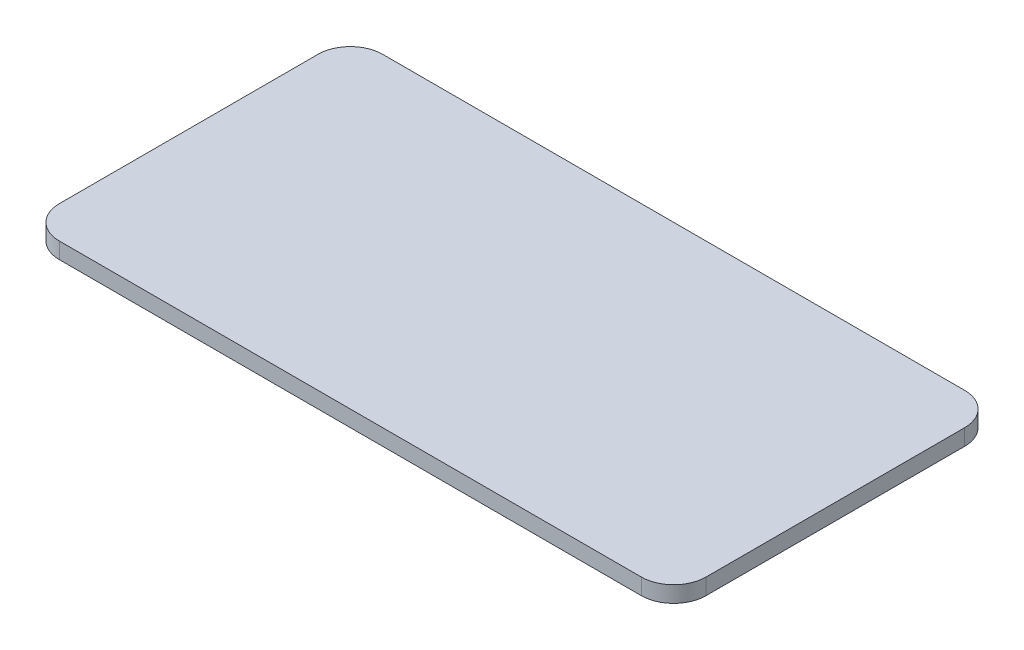
ISO-10303-21;
HEADER;
FILE_DESCRIPTION(('STEP AP214'),'2;1');
FILE_NAME('part.step','',(''),(''),'','','');
FILE_SCHEMA(('AUTOMOTIVE_DESIGN { 1 0 10303 214 1 1 1 1 }'));
ENDSEC;
DATA;
#1=APPLICATION_CONTEXT('core data for automotive mechanical design processes');
#2=APPLICATION_PROTOCOL_DEFINITION('international standard','automotive_design',2000,#1);
#3=PRODUCT_CONTEXT('',#1,'mechanical');
#4=PRODUCT('Part','Part','',(#3));
#5=PRODUCT_RELATED_PRODUCT_CATEGORY('part','',(#4));
#6=PRODUCT_DEFINITION_FORMATION('','',#4);
#7=PRODUCT_DEFINITION_CONTEXT('part definition',#1,'design');
#8=PRODUCT_DEFINITION('design','',#6,#7);
#9=PRODUCT_DEFINITION_SHAPE('','',#8);
#10=(LENGTH_UNIT() NAMED_UNIT(*) SI_UNIT(.MILLI.,.METRE.));
#11=(NAMED_UNIT(*) PLANE_ANGLE_UNIT() SI_UNIT($,.RADIAN.));
#12=(NAMED_UNIT(*) SI_UNIT($,.STERADIAN.) SOLID_ANGLE_UNIT());
#13=UNCERTAINTY_MEASURE_WITH_UNIT(LENGTH_MEASURE(1.E-05),#10,'distance_accuracy_value','');
#14=(GEOMETRIC_REPRESENTATION_CONTEXT(3) GLOBAL_UNCERTAINTY_ASSIGNED_CONTEXT((#13)) GLOBAL_UNIT_ASSIGNED_CONTEXT((#10,
#11,#12)) REPRESENTATION_CONTEXT('',''));
#15=CARTESIAN_POINT('',(0.,0.,0.));
#16=DIRECTION('',(0.,0.,1.));
#17=DIRECTION('',(1.,0.,0.));
#18=AXIS2_PLACEMENT_3D('',#15,#16,#17);
#19=CARTESIAN_POINT('',(20.,0.5,10.));
#20=DIRECTION('',(-1.,0.,0.));
#21=DIRECTION('',(0.,0.,1.));
#22=AXIS2_PLACEMENT_3D('',#19,#20,#21);
#23=PLANE('',#22);
#24=DIRECTION('',(0.,0.,-1.));
#25=VECTOR('',#24,1.);
#26=CARTESIAN_POINT('',(20.,-0.5,10.));
#27=LINE('',#26,#25);
#28=CARTESIAN_POINT('',(20.,-0.5,8.));
#29=VERTEX_POINT('',#28);
#30=CARTESIAN_POINT('',(20.,-0.5,-8.));
#31=VERTEX_POINT('',#30);
#32=EDGE_CURVE('E142',#29,#31,#27,.T.);
#33=ORIENTED_EDGE('',*,*,#32,.T.);
#34=DIRECTION('',(0.,-1.,0.));
#35=VECTOR('',#34,1.);
#36=CARTESIAN_POINT('',(20.,0.5,-8.));
#37=LINE('',#36,#35);
#38=CARTESIAN_POINT('',(20.,0.5,-8.));
#39=VERTEX_POINT('',#38);
#40=EDGE_CURVE('E175',#31,#39,#37,.F.);
#41=ORIENTED_EDGE('',*,*,#40,.T.);
#42=DIRECTION('',(0.,0.,-1.));
#43=VECTOR('',#42,1.);
#44=CARTESIAN_POINT('',(20.,0.5,10.));
#45=LINE('',#44,#43);
#46=CARTESIAN_POINT('',(20.,0.5,8.));
#47=VERTEX_POINT('',#46);
#48=EDGE_CURVE('E140',#47,#39,#45,.T.);
#49=ORIENTED_EDGE('',*,*,#48,.F.);
#50=DIRECTION('',(0.,-1.,0.));
#51=VECTOR('',#50,1.);
#52=CARTESIAN_POINT('',(20.,0.5,8.));
#53=LINE('',#52,#51);
#54=EDGE_CURVE('E171',#47,#29,#53,.T.);
#55=ORIENTED_EDGE('',*,*,#54,.T.);
#56=EDGE_LOOP('',(#33,#41,#49,#55));
#57=FACE_BOUND('',#56,.T.);
#58=ADVANCED_FACE('F39',(#57),#23,.F.);
#59=CARTESIAN_POINT('',(-20.,0.5,-10.));
#60=DIRECTION('',(0.,0.,1.));
#61=DIRECTION('',(1.,0.,0.));
#62=AXIS2_PLACEMENT_3D('',#59,#60,#61);
#63=PLANE('',#62);
#64=DIRECTION('',(-1.,0.,0.));
#65=VECTOR('',#64,1.);
#66=CARTESIAN_POINT('',(-20.,-0.5,-10.));
#67=LINE('',#66,#65);
#68=CARTESIAN_POINT('',(18.,-0.5,-10.));
#69=VERTEX_POINT('',#68);
#70=CARTESIAN_POINT('',(-18.,-0.5,-10.));
#71=VERTEX_POINT('',#70);
#72=EDGE_CURVE('E136',#69,#71,#67,.T.);
#73=ORIENTED_EDGE('',*,*,#72,.T.);
#74=DIRECTION('',(0.,-1.,0.));
#75=VECTOR('',#74,1.);
#76=CARTESIAN_POINT('',(-18.,0.5,-10.));
#77=LINE('',#76,#75);
#78=CARTESIAN_POINT('',(-18.,0.5,-10.));
#79=VERTEX_POINT('',#78);
#80=EDGE_CURVE('E111',#71,#79,#77,.F.);
#81=ORIENTED_EDGE('',*,*,#80,.T.);
#82=DIRECTION('',(-1.,0.,0.));
#83=VECTOR('',#82,1.);
#84=CARTESIAN_POINT('',(-20.,0.5,-10.));
#85=LINE('',#84,#83);
#86=CARTESIAN_POINT('',(18.,0.5,-10.));
#87=VERTEX_POINT('',#86);
#88=EDGE_CURVE('E182',#87,#79,#85,.T.);
#89=ORIENTED_EDGE('',*,*,#88,.F.);
#90=DIRECTION('',(0.,-1.,0.));
#91=VECTOR('',#90,1.);
#92=CARTESIAN_POINT('',(18.,0.5,-10.));
#93=LINE('',#92,#91);
#94=EDGE_CURVE('E117',#87,#69,#93,.T.);
#95=ORIENTED_EDGE('',*,*,#94,.T.);
#96=EDGE_LOOP('',(#73,#81,#89,#95));
#97=FACE_BOUND('',#96,.T.);
#98=ADVANCED_FACE('F203',(#97),#63,.F.);
#99=CARTESIAN_POINT('',(-20.,0.5,10.));
#100=DIRECTION('',(1.,0.,0.));
#101=DIRECTION('',(0.,0.,-1.));
#102=AXIS2_PLACEMENT_3D('',#99,#100,#101);
#103=PLANE('',#102);
#104=DIRECTION('',(0.,0.,1.));
#105=VECTOR('',#104,1.);
#106=CARTESIAN_POINT('',(-20.,0.5,10.));
#107=LINE('',#106,#105);
#108=CARTESIAN_POINT('',(-20.,0.5,-8.));
#109=VERTEX_POINT('',#108);
#110=CARTESIAN_POINT('',(-20.,0.5,8.));
#111=VERTEX_POINT('',#110);
#112=EDGE_CURVE('E126',#109,#111,#107,.T.);
#113=ORIENTED_EDGE('',*,*,#112,.F.);
#114=DIRECTION('',(0.,-1.,0.));
#115=VECTOR('',#114,1.);
#116=CARTESIAN_POINT('',(-20.,0.5,-8.));
#117=LINE('',#116,#115);
#118=CARTESIAN_POINT('',(-20.,-0.5,-8.));
#119=VERTEX_POINT('',#118);
#120=EDGE_CURVE('E110',#109,#119,#117,.T.);
#121=ORIENTED_EDGE('',*,*,#120,.T.);
#122=DIRECTION('',(0.,0.,1.));
#123=VECTOR('',#122,1.);
#124=CARTESIAN_POINT('',(-20.,-0.5,10.));
#125=LINE('',#124,#123);
#126=CARTESIAN_POINT('',(-20.,-0.5,8.));
#127=VERTEX_POINT('',#126);
#128=EDGE_CURVE('E124',#119,#127,#125,.T.);
#129=ORIENTED_EDGE('',*,*,#128,.T.);
#130=DIRECTION('',(0.,-1.,0.));
#131=VECTOR('',#130,1.);
#132=CARTESIAN_POINT('',(-20.,0.5,8.));
#133=LINE('',#132,#131);
#134=EDGE_CURVE('E129',#127,#111,#133,.F.);
#135=ORIENTED_EDGE('',*,*,#134,.T.);
#136=EDGE_LOOP('',(#113,#121,#129,#135));
#137=FACE_BOUND('',#136,.T.);
#138=ADVANCED_FACE('F123',(#137),#103,.F.);
#139=CARTESIAN_POINT('',(-20.,0.5,10.));
#140=DIRECTION('',(0.,0.,-1.));
#141=DIRECTION('',(-1.,0.,0.));
#142=AXIS2_PLACEMENT_3D('',#139,#140,#141);
#143=PLANE('',#142);
#144=DIRECTION('',(1.,0.,0.));
#145=VECTOR('',#144,1.);
#146=CARTESIAN_POINT('',(-20.,0.5,10.));
#147=LINE('',#146,#145);
#148=CARTESIAN_POINT('',(-18.,0.5,10.));
#149=VERTEX_POINT('',#148);
#150=CARTESIAN_POINT('',(18.,0.5,10.));
#151=VERTEX_POINT('',#150);
#152=EDGE_CURVE('E147',#149,#151,#147,.T.);
#153=ORIENTED_EDGE('',*,*,#152,.F.);
#154=DIRECTION('',(0.,-1.,0.));
#155=VECTOR('',#154,1.);
#156=CARTESIAN_POINT('',(-18.,0.5,10.));
#157=LINE('',#156,#155);
#158=CARTESIAN_POINT('',(-18.,-0.5,10.));
#159=VERTEX_POINT('',#158);
#160=EDGE_CURVE('E11',#149,#159,#157,.T.);
#161=ORIENTED_EDGE('',*,*,#160,.T.);
#162=DIRECTION('',(1.,0.,0.));
#163=VECTOR('',#162,1.);
#164=CARTESIAN_POINT('',(-20.,-0.5,10.));
#165=LINE('',#164,#163);
#166=CARTESIAN_POINT('',(18.,-0.5,10.));
#167=VERTEX_POINT('',#166);
#168=EDGE_CURVE('E135',#159,#167,#165,.T.);
#169=ORIENTED_EDGE('',*,*,#168,.T.);
#170=DIRECTION('',(0.,-1.,0.));
#171=VECTOR('',#170,1.);
#172=CARTESIAN_POINT('',(18.,0.5,10.));
#173=LINE('',#172,#171);
#174=EDGE_CURVE('E48',#167,#151,#173,.F.);
#175=ORIENTED_EDGE('',*,*,#174,.T.);
#176=EDGE_LOOP('',(#153,#161,#169,#175));
#177=FACE_BOUND('',#176,.T.);
#178=ADVANCED_FACE('F210',(#177),#143,.F.);
#179=CARTESIAN_POINT('',(0.,0.5,0.));
#180=DIRECTION('',(0.,-1.,0.));
#181=DIRECTION('',(0.,0.,-1.));
#182=AXIS2_PLACEMENT_3D('',#179,#180,#181);
#183=PLANE('',#182);
#184=ORIENTED_EDGE('',*,*,#88,.T.);
#185=CARTESIAN_POINT('',(-18.,0.5,-8.));
#186=DIRECTION('',(0.,-1.,0.));
#187=DIRECTION('',(0.,0.,-1.));
#188=AXIS2_PLACEMENT_3D('',#185,#186,#187);
#189=CIRCLE('',#188,2.);
#190=EDGE_CURVE('E168',#79,#109,#189,.F.);
#191=ORIENTED_EDGE('',*,*,#190,.T.);
#192=ORIENTED_EDGE('',*,*,#112,.T.);
#193=CARTESIAN_POINT('',(-18.,0.5,8.));
#194=DIRECTION('',(0.,-1.,0.));
#195=DIRECTION('',(0.,0.,-1.));
#196=AXIS2_PLACEMENT_3D('',#193,#194,#195);
#197=CIRCLE('',#196,2.);
#198=EDGE_CURVE('E61',#111,#149,#197,.F.);
#199=ORIENTED_EDGE('',*,*,#198,.T.);
#200=ORIENTED_EDGE('',*,*,#152,.T.);
#201=CARTESIAN_POINT('',(18.,0.5,8.));
#202=DIRECTION('',(0.,-1.,0.));
#203=DIRECTION('',(0.,0.,-1.));
#204=AXIS2_PLACEMENT_3D('',#201,#202,#203);
#205=CIRCLE('',#204,2.);
#206=EDGE_CURVE('E160',#151,#47,#205,.F.);
#207=ORIENTED_EDGE('',*,*,#206,.T.);
#208=ORIENTED_EDGE('',*,*,#48,.T.);
#209=CARTESIAN_POINT('',(18.,0.5,-8.));
#210=DIRECTION('',(0.,-1.,0.));
#211=DIRECTION('',(0.,0.,-1.));
#212=AXIS2_PLACEMENT_3D('',#209,#210,#211);
#213=CIRCLE('',#212,2.);
#214=EDGE_CURVE('E165',#39,#87,#213,.F.);
#215=ORIENTED_EDGE('',*,*,#214,.T.);
#216=EDGE_LOOP('',(#184,#191,#192,#199,#200,#207,#208,#215));
#217=FACE_BOUND('',#216,.T.);
#218=ADVANCED_FACE('F201',(#217),#183,.F.);
#219=CARTESIAN_POINT('',(0.,-0.5,0.));
#220=DIRECTION('',(0.,-1.,0.));
#221=DIRECTION('',(0.,0.,-1.));
#222=AXIS2_PLACEMENT_3D('',#219,#220,#221);
#223=PLANE('',#222);
#224=ORIENTED_EDGE('',*,*,#128,.F.);
#225=CARTESIAN_POINT('',(-18.,-0.5,-8.));
#226=DIRECTION('',(0.,-1.,0.));
#227=DIRECTION('',(0.,0.,-1.));
#228=AXIS2_PLACEMENT_3D('',#225,#226,#227);
#229=CIRCLE('',#228,2.);
#230=EDGE_CURVE('E106',#119,#71,#229,.T.);
#231=ORIENTED_EDGE('',*,*,#230,.T.);
#232=ORIENTED_EDGE('',*,*,#72,.F.);
#233=CARTESIAN_POINT('',(18.,-0.5,-8.));
#234=DIRECTION('',(0.,-1.,0.));
#235=DIRECTION('',(0.,0.,-1.));
#236=AXIS2_PLACEMENT_3D('',#233,#234,#235);
#237=CIRCLE('',#236,2.);
#238=EDGE_CURVE('E118',#69,#31,#237,.T.);
#239=ORIENTED_EDGE('',*,*,#238,.T.);
#240=ORIENTED_EDGE('',*,*,#32,.F.);
#241=CARTESIAN_POINT('',(18.,-0.5,8.));
#242=DIRECTION('',(0.,-1.,0.));
#243=DIRECTION('',(0.,0.,-1.));
#244=AXIS2_PLACEMENT_3D('',#241,#242,#243);
#245=CIRCLE('',#244,2.);
#246=EDGE_CURVE('E128',#29,#167,#245,.T.);
#247=ORIENTED_EDGE('',*,*,#246,.T.);
#248=ORIENTED_EDGE('',*,*,#168,.F.);
#249=CARTESIAN_POINT('',(-18.,-0.5,8.));
#250=DIRECTION('',(0.,-1.,0.));
#251=DIRECTION('',(0.,0.,-1.));
#252=AXIS2_PLACEMENT_3D('',#249,#250,#251);
#253=CIRCLE('',#252,2.);
#254=EDGE_CURVE('E133',#159,#127,#253,.T.);
#255=ORIENTED_EDGE('',*,*,#254,.T.);
#256=EDGE_LOOP('',(#224,#231,#232,#239,#240,#247,#248,#255));
#257=FACE_BOUND('',#256,.T.);
#258=ADVANCED_FACE('F131',(#257),#223,.T.);
#259=CARTESIAN_POINT('',(-18.,0.5,-8.));
#260=DIRECTION('',(0.,-1.,0.));
#261=DIRECTION('',(0.,0.,-1.));
#262=AXIS2_PLACEMENT_3D('',#259,#260,#261);
#263=CYLINDRICAL_SURFACE('',#262,2.);
#264=ORIENTED_EDGE('',*,*,#190,.F.);
#265=ORIENTED_EDGE('',*,*,#80,.F.);
#266=ORIENTED_EDGE('',*,*,#230,.F.);
#267=ORIENTED_EDGE('',*,*,#120,.F.);
#268=EDGE_LOOP('',(#264,#265,#266,#267));
#269=FACE_BOUND('',#268,.T.);
#270=ADVANCED_FACE('F109',(#269),#263,.T.);
#271=CARTESIAN_POINT('',(18.,0.5,-8.));
#272=DIRECTION('',(0.,-1.,0.));
#273=DIRECTION('',(0.,0.,-1.));
#274=AXIS2_PLACEMENT_3D('',#271,#272,#273);
#275=CYLINDRICAL_SURFACE('',#274,2.);
#276=ORIENTED_EDGE('',*,*,#214,.F.);
#277=ORIENTED_EDGE('',*,*,#40,.F.);
#278=ORIENTED_EDGE('',*,*,#238,.F.);
#279=ORIENTED_EDGE('',*,*,#94,.F.);
#280=EDGE_LOOP('',(#276,#277,#278,#279));
#281=FACE_BOUND('',#280,.T.);
#282=ADVANCED_FACE('F198',(#281),#275,.T.);
#283=CARTESIAN_POINT('',(-18.,0.5,8.));
#284=DIRECTION('',(0.,-1.,0.));
#285=DIRECTION('',(0.,0.,-1.));
#286=AXIS2_PLACEMENT_3D('',#283,#284,#285);
#287=CYLINDRICAL_SURFACE('',#286,2.);
#288=ORIENTED_EDGE('',*,*,#198,.F.);
#289=ORIENTED_EDGE('',*,*,#134,.F.);
#290=ORIENTED_EDGE('',*,*,#254,.F.);
#291=ORIENTED_EDGE('',*,*,#160,.F.);
#292=EDGE_LOOP('',(#288,#289,#290,#291));
#293=FACE_BOUND('',#292,.T.);
#294=ADVANCED_FACE('F218',(#293),#287,.T.);
#295=CARTESIAN_POINT('',(18.,0.5,8.));
#296=DIRECTION('',(0.,-1.,0.));
#297=DIRECTION('',(0.,0.,-1.));
#298=AXIS2_PLACEMENT_3D('',#295,#296,#297);
#299=CYLINDRICAL_SURFACE('',#298,2.);
#300=ORIENTED_EDGE('',*,*,#206,.F.);
#301=ORIENTED_EDGE('',*,*,#174,.F.);
#302=ORIENTED_EDGE('',*,*,#246,.F.);
#303=ORIENTED_EDGE('',*,*,#54,.F.);
#304=EDGE_LOOP('',(#300,#301,#302,#303));
#305=FACE_BOUND('',#304,.T.);
#306=ADVANCED_FACE('F41',(#305),#299,.T.);
#307=CLOSED_SHELL('',(#58,#98,#138,#178,#218,#258,#270,#282,#294,#306));
#308=MANIFOLD_SOLID_BREP('B2',#307);
#309=ADVANCED_BREP_SHAPE_REPRESENTATION('',(#18,#308),#14);
#310=SHAPE_DEFINITION_REPRESENTATION(#9,#309);
ENDSEC;
END-ISO-10303-21;
